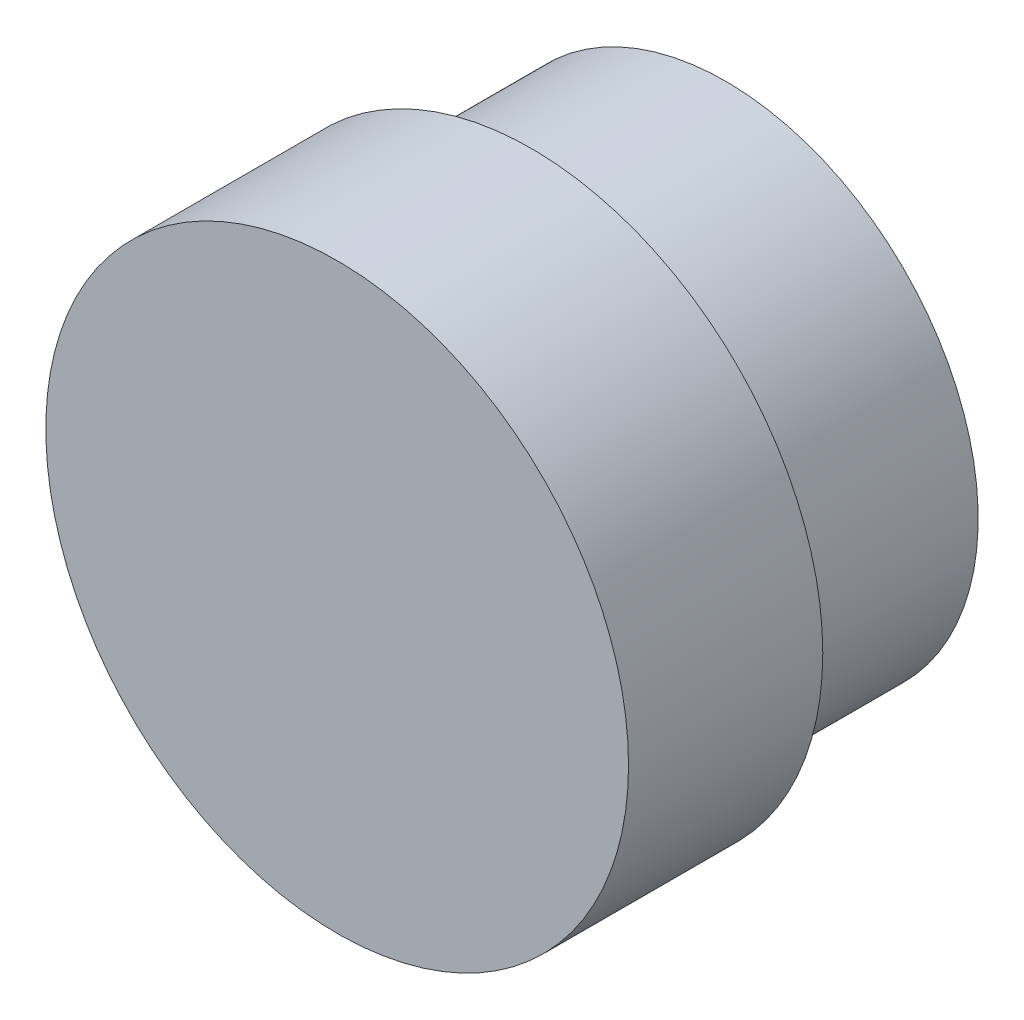
ISO-10303-21;
HEADER;
FILE_DESCRIPTION(('STEP AP214'),'2;1');
FILE_NAME('part.step','',(''),(''),'','','');
FILE_SCHEMA(('AUTOMOTIVE_DESIGN { 1 0 10303 214 1 1 1 1 }'));
ENDSEC;
DATA;
#1=APPLICATION_CONTEXT('core data for automotive mechanical design processes');
#2=APPLICATION_PROTOCOL_DEFINITION('international standard','automotive_design',2000,#1);
#3=PRODUCT_CONTEXT('',#1,'mechanical');
#4=PRODUCT('Part','Part','',(#3));
#5=PRODUCT_RELATED_PRODUCT_CATEGORY('part','',(#4));
#6=PRODUCT_DEFINITION_FORMATION('','',#4);
#7=PRODUCT_DEFINITION_CONTEXT('part definition',#1,'design');
#8=PRODUCT_DEFINITION('design','',#6,#7);
#9=PRODUCT_DEFINITION_SHAPE('','',#8);
#10=(LENGTH_UNIT() NAMED_UNIT(*) SI_UNIT(.MILLI.,.METRE.));
#11=(NAMED_UNIT(*) PLANE_ANGLE_UNIT() SI_UNIT($,.RADIAN.));
#12=(NAMED_UNIT(*) SI_UNIT($,.STERADIAN.) SOLID_ANGLE_UNIT());
#13=UNCERTAINTY_MEASURE_WITH_UNIT(LENGTH_MEASURE(1.E-05),#10,'distance_accuracy_value','');
#14=(GEOMETRIC_REPRESENTATION_CONTEXT(3) GLOBAL_UNCERTAINTY_ASSIGNED_CONTEXT((#13)) GLOBAL_UNIT_ASSIGNED_CONTEXT((#10,
#11,#12)) REPRESENTATION_CONTEXT('',''));
#15=CARTESIAN_POINT('',(0.,0.,0.));
#16=DIRECTION('',(0.,0.,1.));
#17=DIRECTION('',(1.,0.,0.));
#18=AXIS2_PLACEMENT_3D('',#15,#16,#17);
#19=CARTESIAN_POINT('',(0.,0.,50.));
#20=DIRECTION('',(0.,0.,1.));
#21=DIRECTION('',(1.,0.,0.));
#22=AXIS2_PLACEMENT_3D('',#19,#20,#21);
#23=PLANE('',#22);
#24=CARTESIAN_POINT('',(0.,0.,50.));
#25=DIRECTION('',(0.,0.,-1.));
#26=DIRECTION('',(-1.,0.,0.));
#27=AXIS2_PLACEMENT_3D('',#24,#25,#26);
#28=CIRCLE('',#27,6.5);
#29=CARTESIAN_POINT('',(-6.49999999999999,0.,50.));
#30=VERTEX_POINT('',#29);
#31=EDGE_CURVE('E10',#30,#30,#28,.T.);
#32=ORIENTED_EDGE('',*,*,#31,.T.);
#33=EDGE_LOOP('',(#32));
#34=FACE_BOUND('',#33,.T.);
#35=ADVANCED_FACE('F31',(#34),#23,.F.);
#36=CARTESIAN_POINT('',(0.,0.,50.));
#37=DIRECTION('',(0.,0.,-1.));
#38=DIRECTION('',(-1.,0.,0.));
#39=AXIS2_PLACEMENT_3D('',#36,#37,#38);
#40=CYLINDRICAL_SURFACE('',#39,6.5);
#41=ORIENTED_EDGE('',*,*,#31,.F.);
#42=EDGE_LOOP('',(#41));
#43=FACE_BOUND('',#42,.T.);
#44=CARTESIAN_POINT('',(0.,0.,55.));
#45=DIRECTION('',(0.,0.,-1.));
#46=DIRECTION('',(-1.,0.,0.));
#47=AXIS2_PLACEMENT_3D('',#44,#45,#46);
#48=CIRCLE('',#47,6.5);
#49=CARTESIAN_POINT('',(-6.49999999999999,0.,55.));
#50=VERTEX_POINT('',#49);
#51=EDGE_CURVE('E37',#50,#50,#48,.T.);
#52=ORIENTED_EDGE('',*,*,#51,.T.);
#53=EDGE_LOOP('',(#52));
#54=FACE_BOUND('',#53,.T.);
#55=ADVANCED_FACE('F64',(#43,#54),#40,.T.);
#56=CARTESIAN_POINT('',(0.,0.,60.));
#57=DIRECTION('',(0.,0.,1.));
#58=DIRECTION('',(1.,0.,0.));
#59=AXIS2_PLACEMENT_3D('',#56,#57,#58);
#60=PLANE('',#59);
#61=CARTESIAN_POINT('',(0.,0.,60.));
#62=DIRECTION('',(0.,0.,1.));
#63=DIRECTION('',(1.,0.,0.));
#64=AXIS2_PLACEMENT_3D('',#61,#62,#63);
#65=CIRCLE('',#64,7.5);
#66=CARTESIAN_POINT('',(7.49999999999999,0.,60.));
#67=VERTEX_POINT('',#66);
#68=EDGE_CURVE('E41',#67,#67,#65,.T.);
#69=ORIENTED_EDGE('',*,*,#68,.T.);
#70=EDGE_LOOP('',(#69));
#71=FACE_BOUND('',#70,.T.);
#72=ADVANCED_FACE('F61',(#71),#60,.T.);
#73=CARTESIAN_POINT('',(0.,0.,60.));
#74=DIRECTION('',(0.,0.,1.));
#75=DIRECTION('',(1.,0.,0.));
#76=AXIS2_PLACEMENT_3D('',#73,#74,#75);
#77=CYLINDRICAL_SURFACE('',#76,7.5);
#78=CARTESIAN_POINT('',(0.,0.,55.));
#79=DIRECTION('',(0.,0.,1.));
#80=DIRECTION('',(1.,0.,0.));
#81=AXIS2_PLACEMENT_3D('',#78,#79,#80);
#82=CIRCLE('',#81,7.5);
#83=CARTESIAN_POINT('',(7.49999999999999,0.,55.));
#84=VERTEX_POINT('',#83);
#85=EDGE_CURVE('E45',#84,#84,#82,.T.);
#86=ORIENTED_EDGE('',*,*,#85,.T.);
#87=EDGE_LOOP('',(#86));
#88=FACE_BOUND('',#87,.T.);
#89=ORIENTED_EDGE('',*,*,#68,.F.);
#90=EDGE_LOOP('',(#89));
#91=FACE_BOUND('',#90,.T.);
#92=ADVANCED_FACE('F51',(#88,#91),#77,.T.);
#93=CARTESIAN_POINT('',(0.,0.,55.));
#94=DIRECTION('',(0.,0.,1.));
#95=DIRECTION('',(1.,0.,0.));
#96=AXIS2_PLACEMENT_3D('',#93,#94,#95);
#97=PLANE('',#96);
#98=ORIENTED_EDGE('',*,*,#51,.F.);
#99=EDGE_LOOP('',(#98));
#100=FACE_BOUND('',#99,.T.);
#101=ORIENTED_EDGE('',*,*,#85,.F.);
#102=EDGE_LOOP('',(#101));
#103=FACE_BOUND('',#102,.T.);
#104=ADVANCED_FACE('F54',(#100,#103),#97,.F.);
#105=CLOSED_SHELL('',(#35,#55,#72,#92,#104));
#106=MANIFOLD_SOLID_BREP('B2',#105);
#107=ADVANCED_BREP_SHAPE_REPRESENTATION('',(#18,#106),#14);
#108=SHAPE_DEFINITION_REPRESENTATION(#9,#107);
ENDSEC;
END-ISO-10303-21;
